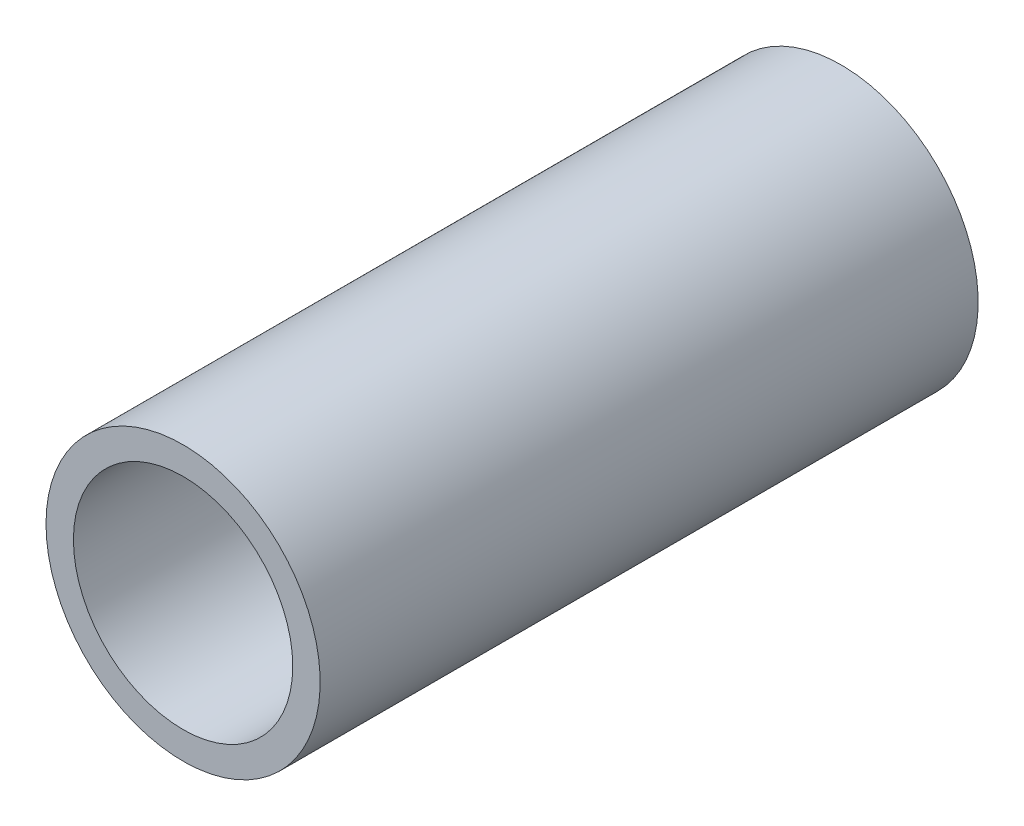
ISO-10303-21;
HEADER;
FILE_DESCRIPTION(('STEP AP214'),'2;1');
FILE_NAME('part.step','',(''),(''),'','','');
FILE_SCHEMA(('AUTOMOTIVE_DESIGN { 1 0 10303 214 1 1 1 1 }'));
ENDSEC;
DATA;
#1=APPLICATION_CONTEXT('core data for automotive mechanical design processes');
#2=APPLICATION_PROTOCOL_DEFINITION('international standard','automotive_design',2000,#1);
#3=PRODUCT_CONTEXT('',#1,'mechanical');
#4=PRODUCT('Part','Part','',(#3));
#5=PRODUCT_RELATED_PRODUCT_CATEGORY('part','',(#4));
#6=PRODUCT_DEFINITION_FORMATION('','',#4);
#7=PRODUCT_DEFINITION_CONTEXT('part definition',#1,'design');
#8=PRODUCT_DEFINITION('design','',#6,#7);
#9=PRODUCT_DEFINITION_SHAPE('','',#8);
#10=(LENGTH_UNIT() NAMED_UNIT(*) SI_UNIT(.MILLI.,.METRE.));
#11=(NAMED_UNIT(*) PLANE_ANGLE_UNIT() SI_UNIT($,.RADIAN.));
#12=(NAMED_UNIT(*) SI_UNIT($,.STERADIAN.) SOLID_ANGLE_UNIT());
#13=UNCERTAINTY_MEASURE_WITH_UNIT(LENGTH_MEASURE(1.E-05),#10,'distance_accuracy_value','');
#14=(GEOMETRIC_REPRESENTATION_CONTEXT(3) GLOBAL_UNCERTAINTY_ASSIGNED_CONTEXT((#13)) GLOBAL_UNIT_ASSIGNED_CONTEXT((#10,
#11,#12)) REPRESENTATION_CONTEXT('',''));
#15=CARTESIAN_POINT('',(0.,0.,0.));
#16=DIRECTION('',(0.,0.,1.));
#17=DIRECTION('',(1.,0.,0.));
#18=AXIS2_PLACEMENT_3D('',#15,#16,#17);
#19=CARTESIAN_POINT('',(0.,0.,9.525));
#20=DIRECTION('',(0.,0.,1.));
#21=DIRECTION('',(1.,0.,0.));
#22=AXIS2_PLACEMENT_3D('',#19,#20,#21);
#23=PLANE('',#22);
#24=CARTESIAN_POINT('',(0.,0.,9.525));
#25=DIRECTION('',(0.,0.,1.));
#26=DIRECTION('',(1.,0.,0.));
#27=AXIS2_PLACEMENT_3D('',#24,#25,#26);
#28=CIRCLE('',#27,3.96875);
#29=CARTESIAN_POINT('',(-3.96875,0.,9.525));
#30=VERTEX_POINT('',#29);
#31=EDGE_CURVE('E10',#30,#30,#28,.T.);
#32=ORIENTED_EDGE('',*,*,#31,.T.);
#33=EDGE_LOOP('',(#32));
#34=FACE_BOUND('',#33,.T.);
#35=CARTESIAN_POINT('',(0.,0.,9.525));
#36=DIRECTION('',(0.,0.,1.));
#37=DIRECTION('',(1.,0.,0.));
#38=AXIS2_PLACEMENT_3D('',#35,#36,#37);
#39=CIRCLE('',#38,3.175);
#40=CARTESIAN_POINT('',(-3.175,0.,9.525));
#41=VERTEX_POINT('',#40);
#42=EDGE_CURVE('E41',#41,#41,#39,.T.);
#43=ORIENTED_EDGE('',*,*,#42,.F.);
#44=EDGE_LOOP('',(#43));
#45=FACE_BOUND('',#44,.T.);
#46=ADVANCED_FACE('F30',(#34,#45),#23,.T.);
#47=CARTESIAN_POINT('',(0.,0.,-9.525));
#48=DIRECTION('',(0.,0.,1.));
#49=DIRECTION('',(1.,0.,0.));
#50=AXIS2_PLACEMENT_3D('',#47,#48,#49);
#51=PLANE('',#50);
#52=CARTESIAN_POINT('',(0.,0.,-9.525));
#53=DIRECTION('',(0.,0.,1.));
#54=DIRECTION('',(1.,0.,0.));
#55=AXIS2_PLACEMENT_3D('',#52,#53,#54);
#56=CIRCLE('',#55,3.96875);
#57=CARTESIAN_POINT('',(-3.96875,0.,-9.525));
#58=VERTEX_POINT('',#57);
#59=EDGE_CURVE('E34',#58,#58,#56,.T.);
#60=ORIENTED_EDGE('',*,*,#59,.F.);
#61=EDGE_LOOP('',(#60));
#62=FACE_BOUND('',#61,.T.);
#63=CARTESIAN_POINT('',(0.,0.,-9.525));
#64=DIRECTION('',(0.,0.,1.));
#65=DIRECTION('',(1.,0.,0.));
#66=AXIS2_PLACEMENT_3D('',#63,#64,#65);
#67=CIRCLE('',#66,3.175);
#68=CARTESIAN_POINT('',(-3.175,0.,-9.525));
#69=VERTEX_POINT('',#68);
#70=EDGE_CURVE('E43',#69,#69,#67,.T.);
#71=ORIENTED_EDGE('',*,*,#70,.T.);
#72=EDGE_LOOP('',(#71));
#73=FACE_BOUND('',#72,.T.);
#74=ADVANCED_FACE('F53',(#62,#73),#51,.F.);
#75=CARTESIAN_POINT('',(0.,0.,9.525));
#76=DIRECTION('',(0.,0.,-1.));
#77=DIRECTION('',(-1.,0.,0.));
#78=AXIS2_PLACEMENT_3D('',#75,#76,#77);
#79=CYLINDRICAL_SURFACE('',#78,3.96875);
#80=CARTESIAN_POINT('',(-3.96875,0.,9.525));
#81=CARTESIAN_POINT('',(-3.96875,0.,9.3265625));
#82=CARTESIAN_POINT('',(-3.96875,0.,9.128125));
#83=CARTESIAN_POINT('',(-3.96875,0.,8.73125));
#84=CARTESIAN_POINT('',(-3.96875,0.,8.5328125));
#85=CARTESIAN_POINT('',(-3.96875,0.,8.1359375));
#86=CARTESIAN_POINT('',(-3.96875,0.,7.9375));
#87=CARTESIAN_POINT('',(-3.96875,0.,7.540625));
#88=CARTESIAN_POINT('',(-3.96875,0.,7.3421875));
#89=CARTESIAN_POINT('',(-3.96875,0.,6.9453125));
#90=CARTESIAN_POINT('',(-3.96875,0.,6.746875));
#91=CARTESIAN_POINT('',(-3.96875,0.,6.35));
#92=CARTESIAN_POINT('',(-3.96875,0.,6.1515625));
#93=CARTESIAN_POINT('',(-3.96875,0.,5.7546875));
#94=CARTESIAN_POINT('',(-3.96875,0.,5.55625));
#95=CARTESIAN_POINT('',(-3.96875,0.,5.159375));
#96=CARTESIAN_POINT('',(-3.96875,0.,4.9609375));
#97=CARTESIAN_POINT('',(-3.96875,0.,4.5640625));
#98=CARTESIAN_POINT('',(-3.96875,0.,4.365625));
#99=CARTESIAN_POINT('',(-3.96875,0.,3.96875));
#100=CARTESIAN_POINT('',(-3.96875,0.,3.7703125));
#101=CARTESIAN_POINT('',(-3.96875,0.,3.3734375));
#102=CARTESIAN_POINT('',(-3.96875,0.,3.175));
#103=CARTESIAN_POINT('',(-3.96875,0.,2.778125));
#104=CARTESIAN_POINT('',(-3.96875,0.,2.5796875));
#105=CARTESIAN_POINT('',(-3.96875,0.,2.1828125));
#106=CARTESIAN_POINT('',(-3.96875,0.,1.984375));
#107=CARTESIAN_POINT('',(-3.96875,0.,1.5875));
#108=CARTESIAN_POINT('',(-3.96875,0.,1.3890625));
#109=CARTESIAN_POINT('',(-3.96875,0.,0.992187500000001));
#110=CARTESIAN_POINT('',(-3.96875,0.,0.793750000000001));
#111=CARTESIAN_POINT('',(-3.96875,0.,0.396875));
#112=CARTESIAN_POINT('',(-3.96875,0.,0.1984375));
#113=CARTESIAN_POINT('',(-3.96875,0.,-0.1984375));
#114=CARTESIAN_POINT('',(-3.96875,0.,-0.396875));
#115=CARTESIAN_POINT('',(-3.96875,0.,-0.793750000000001));
#116=CARTESIAN_POINT('',(-3.96875,0.,-0.992187500000001));
#117=CARTESIAN_POINT('',(-3.96875,0.,-1.3890625));
#118=CARTESIAN_POINT('',(-3.96875,0.,-1.5875));
#119=CARTESIAN_POINT('',(-3.96875,0.,-1.984375));
#120=CARTESIAN_POINT('',(-3.96875,0.,-2.1828125));
#121=CARTESIAN_POINT('',(-3.96875,0.,-2.5796875));
#122=CARTESIAN_POINT('',(-3.96875,0.,-2.778125));
#123=CARTESIAN_POINT('',(-3.96875,0.,-3.175));
#124=CARTESIAN_POINT('',(-3.96875,0.,-3.3734375));
#125=CARTESIAN_POINT('',(-3.96875,0.,-3.7703125));
#126=CARTESIAN_POINT('',(-3.96875,0.,-3.96875));
#127=CARTESIAN_POINT('',(-3.96875,0.,-4.365625));
#128=CARTESIAN_POINT('',(-3.96875,0.,-4.5640625));
#129=CARTESIAN_POINT('',(-3.96875,0.,-4.9609375));
#130=CARTESIAN_POINT('',(-3.96875,0.,-5.159375));
#131=CARTESIAN_POINT('',(-3.96875,0.,-5.55625));
#132=CARTESIAN_POINT('',(-3.96875,0.,-5.7546875));
#133=CARTESIAN_POINT('',(-3.96875,0.,-6.1515625));
#134=CARTESIAN_POINT('',(-3.96875,0.,-6.35));
#135=CARTESIAN_POINT('',(-3.96875,0.,-6.746875));
#136=CARTESIAN_POINT('',(-3.96875,0.,-6.9453125));
#137=CARTESIAN_POINT('',(-3.96875,0.,-7.3421875));
#138=CARTESIAN_POINT('',(-3.96875,0.,-7.540625));
#139=CARTESIAN_POINT('',(-3.96875,0.,-7.9375));
#140=CARTESIAN_POINT('',(-3.96875,0.,-8.1359375));
#141=CARTESIAN_POINT('',(-3.96875,0.,-8.5328125));
#142=CARTESIAN_POINT('',(-3.96875,0.,-8.73125));
#143=CARTESIAN_POINT('',(-3.96875,0.,-9.128125));
#144=CARTESIAN_POINT('',(-3.96875,0.,-9.3265625));
#145=CARTESIAN_POINT('',(-3.96875,0.,-9.525));
#146=B_SPLINE_CURVE_WITH_KNOTS('',3,(#80,#81,#82,#83,#84,#85,#86,#87,#88,#89,#90,#91,#92,#93,
#94,#95,#96,#97,#98,#99,#100,#101,#102,#103,#104,#105,#106,#107,#108,#109,#110,#111,#112,#113,
#114,#115,#116,#117,#118,#119,#120,#121,#122,#123,#124,#125,#126,#127,#128,#129,#130,#131,#132,
#133,#134,#135,#136,#137,#138,#139,#140,#141,#142,#143,#144,#145),.UNSPECIFIED.,.F.,.F.,(4,2,2,
2,2,2,2,2,2,2,2,2,2,2,2,2,2,2,2,2,2,2,2,2,2,2,2,2,2,2,2,2,4),(0.,0.5953125,1.190625,1.7859375,
2.38125,2.9765625,3.571875,4.1671875,4.7625,5.3578125,5.953125,6.5484375,7.14375,7.7390625,
8.334375,8.9296875,9.525,10.1203125,10.715625,11.3109375,11.90625,12.5015625,13.096875,
13.6921875,14.2875,14.8828125,15.478125,16.0734375,16.66875,17.2640625,17.859375,18.4546875,
19.05),.UNSPECIFIED.);
#147=EDGE_CURVE('BSEAM32',#30,#58,#146,.T.);
#148=ORIENTED_EDGE('',*,*,#31,.F.);
#149=ORIENTED_EDGE('',*,*,#59,.T.);
#150=ORIENTED_EDGE('',*,*,#147,.T.);
#151=ORIENTED_EDGE('',*,*,#147,.F.);
#152=EDGE_LOOP('',(#148,#150,#149,#151));
#153=FACE_BOUND('',#152,.T.);
#154=ADVANCED_FACE('F32',(#153),#79,.T.);
#155=CARTESIAN_POINT('',(0.,0.,9.525));
#156=DIRECTION('',(0.,0.,-1.));
#157=DIRECTION('',(-1.,0.,0.));
#158=AXIS2_PLACEMENT_3D('',#155,#156,#157);
#159=CYLINDRICAL_SURFACE('',#158,3.175);
#160=CARTESIAN_POINT('',(-3.175,0.,9.525));
#161=CARTESIAN_POINT('',(-3.175,0.,9.3265625));
#162=CARTESIAN_POINT('',(-3.175,0.,9.128125));
#163=CARTESIAN_POINT('',(-3.175,0.,8.73125));
#164=CARTESIAN_POINT('',(-3.175,0.,8.5328125));
#165=CARTESIAN_POINT('',(-3.175,0.,8.1359375));
#166=CARTESIAN_POINT('',(-3.175,0.,7.9375));
#167=CARTESIAN_POINT('',(-3.175,0.,7.540625));
#168=CARTESIAN_POINT('',(-3.175,0.,7.3421875));
#169=CARTESIAN_POINT('',(-3.175,0.,6.9453125));
#170=CARTESIAN_POINT('',(-3.175,0.,6.746875));
#171=CARTESIAN_POINT('',(-3.175,0.,6.35));
#172=CARTESIAN_POINT('',(-3.175,0.,6.1515625));
#173=CARTESIAN_POINT('',(-3.175,0.,5.7546875));
#174=CARTESIAN_POINT('',(-3.175,0.,5.55625));
#175=CARTESIAN_POINT('',(-3.175,0.,5.159375));
#176=CARTESIAN_POINT('',(-3.175,0.,4.9609375));
#177=CARTESIAN_POINT('',(-3.175,0.,4.5640625));
#178=CARTESIAN_POINT('',(-3.175,0.,4.365625));
#179=CARTESIAN_POINT('',(-3.175,0.,3.96875));
#180=CARTESIAN_POINT('',(-3.175,0.,3.7703125));
#181=CARTESIAN_POINT('',(-3.175,0.,3.3734375));
#182=CARTESIAN_POINT('',(-3.175,0.,3.175));
#183=CARTESIAN_POINT('',(-3.175,0.,2.778125));
#184=CARTESIAN_POINT('',(-3.175,0.,2.5796875));
#185=CARTESIAN_POINT('',(-3.175,0.,2.1828125));
#186=CARTESIAN_POINT('',(-3.175,0.,1.984375));
#187=CARTESIAN_POINT('',(-3.175,0.,1.5875));
#188=CARTESIAN_POINT('',(-3.175,0.,1.3890625));
#189=CARTESIAN_POINT('',(-3.175,0.,0.992187499999999));
#190=CARTESIAN_POINT('',(-3.175,0.,0.793749999999999));
#191=CARTESIAN_POINT('',(-3.175,0.,0.396874999999998));
#192=CARTESIAN_POINT('',(-3.175,0.,0.198437499999998));
#193=CARTESIAN_POINT('',(-3.175,0.,-0.198437500000002));
#194=CARTESIAN_POINT('',(-3.175,0.,-0.396875000000002));
#195=CARTESIAN_POINT('',(-3.175,0.,-0.793750000000002));
#196=CARTESIAN_POINT('',(-3.175,0.,-0.992187500000002));
#197=CARTESIAN_POINT('',(-3.175,0.,-1.3890625));
#198=CARTESIAN_POINT('',(-3.175,0.,-1.5875));
#199=CARTESIAN_POINT('',(-3.175,0.,-1.984375));
#200=CARTESIAN_POINT('',(-3.175,0.,-2.1828125));
#201=CARTESIAN_POINT('',(-3.175,0.,-2.5796875));
#202=CARTESIAN_POINT('',(-3.175,0.,-2.778125));
#203=CARTESIAN_POINT('',(-3.175,0.,-3.175));
#204=CARTESIAN_POINT('',(-3.175,0.,-3.3734375));
#205=CARTESIAN_POINT('',(-3.175,0.,-3.7703125));
#206=CARTESIAN_POINT('',(-3.175,0.,-3.96875));
#207=CARTESIAN_POINT('',(-3.175,0.,-4.365625));
#208=CARTESIAN_POINT('',(-3.175,0.,-4.5640625));
#209=CARTESIAN_POINT('',(-3.175,0.,-4.9609375));
#210=CARTESIAN_POINT('',(-3.175,0.,-5.159375));
#211=CARTESIAN_POINT('',(-3.175,0.,-5.55625));
#212=CARTESIAN_POINT('',(-3.175,0.,-5.7546875));
#213=CARTESIAN_POINT('',(-3.175,0.,-6.1515625));
#214=CARTESIAN_POINT('',(-3.175,0.,-6.35));
#215=CARTESIAN_POINT('',(-3.175,0.,-6.746875));
#216=CARTESIAN_POINT('',(-3.175,0.,-6.9453125));
#217=CARTESIAN_POINT('',(-3.175,0.,-7.3421875));
#218=CARTESIAN_POINT('',(-3.175,0.,-7.540625));
#219=CARTESIAN_POINT('',(-3.175,0.,-7.9375));
#220=CARTESIAN_POINT('',(-3.175,0.,-8.1359375));
#221=CARTESIAN_POINT('',(-3.175,0.,-8.5328125));
#222=CARTESIAN_POINT('',(-3.175,0.,-8.73125));
#223=CARTESIAN_POINT('',(-3.175,0.,-9.128125));
#224=CARTESIAN_POINT('',(-3.175,0.,-9.3265625));
#225=CARTESIAN_POINT('',(-3.175,0.,-9.525));
#226=B_SPLINE_CURVE_WITH_KNOTS('',3,(#160,#161,#162,#163,#164,#165,#166,#167,#168,#169,#170,
#171,#172,#173,#174,#175,#176,#177,#178,#179,#180,#181,#182,#183,#184,#185,#186,#187,#188,#189,
#190,#191,#192,#193,#194,#195,#196,#197,#198,#199,#200,#201,#202,#203,#204,#205,#206,#207,#208,
#209,#210,#211,#212,#213,#214,#215,#216,#217,#218,#219,#220,#221,#222,#223,#224,#225),
.UNSPECIFIED.,.F.,.F.,(4,2,2,2,2,2,2,2,2,2,2,2,2,2,2,2,2,2,2,2,2,2,2,2,2,2,2,2,2,2,2,2,4),(0.,
0.595312499999999,1.190625,1.7859375,2.38125,2.9765625,3.571875,4.1671875,4.7625,5.3578125,
5.953125,6.5484375,7.14375,7.7390625,8.334375,8.9296875,9.525,10.1203125,10.715625,11.3109375,
11.90625,12.5015625,13.096875,13.6921875,14.2875,14.8828125,15.478125,16.0734375,16.66875,
17.2640625,17.859375,18.4546875,19.05),.UNSPECIFIED.);
#227=EDGE_CURVE('BSEAM49',#41,#69,#226,.T.);
#228=ORIENTED_EDGE('',*,*,#42,.T.);
#229=ORIENTED_EDGE('',*,*,#70,.F.);
#230=ORIENTED_EDGE('',*,*,#227,.T.);
#231=ORIENTED_EDGE('',*,*,#227,.F.);
#232=EDGE_LOOP('',(#228,#230,#229,#231));
#233=FACE_BOUND('',#232,.T.);
#234=ADVANCED_FACE('F49',(#233),#159,.F.);
#235=CLOSED_SHELL('',(#46,#74,#154,#234));
#236=MANIFOLD_SOLID_BREP('B2',#235);
#237=ADVANCED_BREP_SHAPE_REPRESENTATION('',(#18,#236),#14);
#238=SHAPE_DEFINITION_REPRESENTATION(#9,#237);
ENDSEC;
END-ISO-10303-21;
